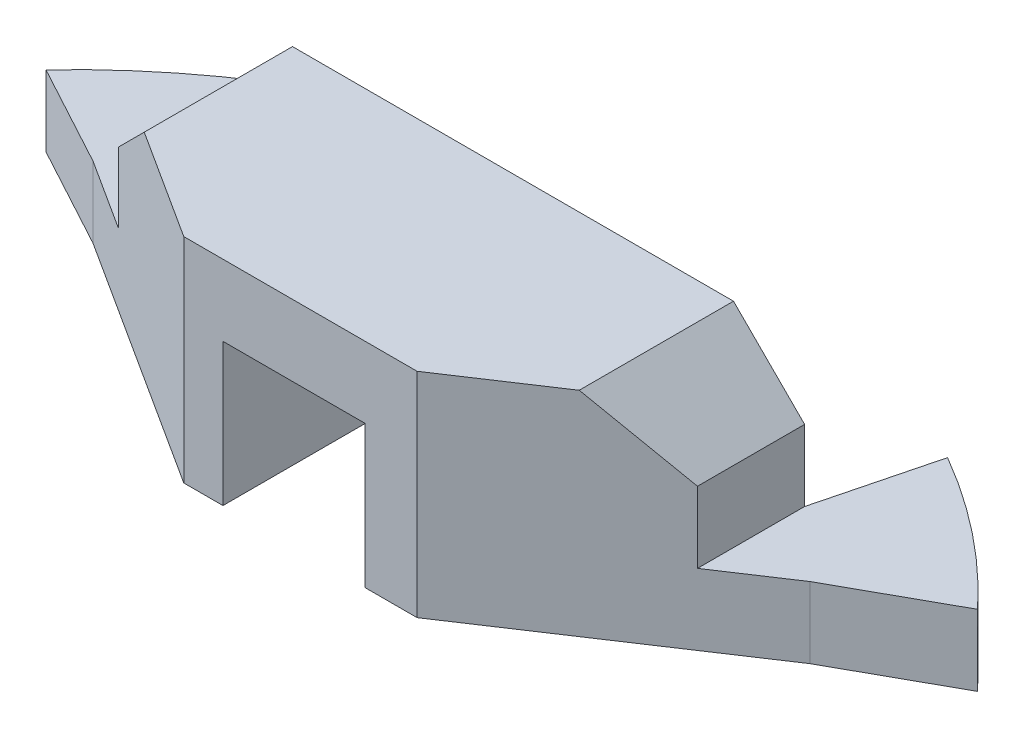
ISO-10303-21;
HEADER;
FILE_DESCRIPTION(('STEP AP214'),'2;1');
FILE_NAME('part.step','',(''),(''),'','','');
FILE_SCHEMA(('AUTOMOTIVE_DESIGN { 1 0 10303 214 1 1 1 1 }'));
ENDSEC;
DATA;
#1=APPLICATION_CONTEXT('core data for automotive mechanical design processes');
#2=APPLICATION_PROTOCOL_DEFINITION('international standard','automotive_design',2000,#1);
#3=PRODUCT_CONTEXT('',#1,'mechanical');
#4=PRODUCT('Part','Part','',(#3));
#5=PRODUCT_RELATED_PRODUCT_CATEGORY('part','',(#4));
#6=PRODUCT_DEFINITION_FORMATION('','',#4);
#7=PRODUCT_DEFINITION_CONTEXT('part definition',#1,'design');
#8=PRODUCT_DEFINITION('design','',#6,#7);
#9=PRODUCT_DEFINITION_SHAPE('','',#8);
#10=(LENGTH_UNIT() NAMED_UNIT(*) SI_UNIT(.MILLI.,.METRE.));
#11=(NAMED_UNIT(*) PLANE_ANGLE_UNIT() SI_UNIT($,.RADIAN.));
#12=(NAMED_UNIT(*) SI_UNIT($,.STERADIAN.) SOLID_ANGLE_UNIT());
#13=UNCERTAINTY_MEASURE_WITH_UNIT(LENGTH_MEASURE(1.E-05),#10,'distance_accuracy_value','');
#14=(GEOMETRIC_REPRESENTATION_CONTEXT(3) GLOBAL_UNCERTAINTY_ASSIGNED_CONTEXT((#13)) GLOBAL_UNIT_ASSIGNED_CONTEXT((#10,
#11,#12)) REPRESENTATION_CONTEXT('',''));
#15=CARTESIAN_POINT('',(0.,0.,0.));
#16=DIRECTION('',(0.,0.,1.));
#17=DIRECTION('',(1.,0.,0.));
#18=AXIS2_PLACEMENT_3D('',#15,#16,#17);
#19=CARTESIAN_POINT('',(0.,0.,0.));
#20=DIRECTION('',(0.,1.,0.));
#21=DIRECTION('',(0.,0.,1.));
#22=AXIS2_PLACEMENT_3D('',#19,#20,#21);
#23=PLANE('',#22);
#24=DIRECTION('',(1.,0.,0.));
#25=VECTOR('',#24,1.);
#26=CARTESIAN_POINT('',(0.,0.,-61.8867391177274));
#27=LINE('',#26,#25);
#28=CARTESIAN_POINT('',(-41.,0.,-61.8867391177274));
#29=VERTEX_POINT('',#28);
#30=CARTESIAN_POINT('',(-10.,0.,-61.8867391177274));
#31=VERTEX_POINT('',#30);
#32=EDGE_CURVE('E266',#29,#31,#27,.T.);
#33=ORIENTED_EDGE('',*,*,#32,.T.);
#34=DIRECTION('',(0.,0.,1.));
#35=VECTOR('',#34,1.);
#36=CARTESIAN_POINT('',(-10.,0.,0.));
#37=LINE('',#36,#35);
#38=CARTESIAN_POINT('',(-10.,0.,-31.1120093792649));
#39=VERTEX_POINT('',#38);
#40=EDGE_CURVE('E11',#31,#39,#37,.T.);
#41=ORIENTED_EDGE('',*,*,#40,.T.);
#42=DIRECTION('',(1.,0.,0.));
#43=VECTOR('',#42,1.);
#44=CARTESIAN_POINT('',(0.,0.,-31.1120093792649));
#45=LINE('',#44,#43);
#46=CARTESIAN_POINT('',(-15.51042360808,0.,-31.1120093792649));
#47=VERTEX_POINT('',#46);
#48=EDGE_CURVE('E293',#47,#39,#45,.T.);
#49=ORIENTED_EDGE('',*,*,#48,.F.);
#50=DIRECTION('',(0.841770349735374,0.,0.539835788278608));
#51=VECTOR('',#50,1.);
#52=CARTESIAN_POINT('',(9.61776043099237,0.,-14.9970523211944));
#53=LINE('',#52,#51);
#54=CARTESIAN_POINT('',(-51.0648929316952,0.,-53.9134480141316));
#55=VERTEX_POINT('',#54);
#56=EDGE_CURVE('E289',#55,#47,#53,.T.);
#57=ORIENTED_EDGE('',*,*,#56,.F.);
#58=DIRECTION('',(0.87933531027418,0.,0.476203120637625));
#59=VECTOR('',#58,1.);
#60=CARTESIAN_POINT('',(10.9958810973952,0.,-20.3045005323974));
#61=LINE('',#60,#59);
#62=CARTESIAN_POINT('',(-65.4952623120171,0.,-61.7281995094631));
#63=VERTEX_POINT('',#62);
#64=EDGE_CURVE('E285',#63,#55,#61,.T.);
#65=ORIENTED_EDGE('',*,*,#64,.F.);
#66=CARTESIAN_POINT('',(0.,0.,0.));
#67=DIRECTION('',(0.,1.,0.));
#68=DIRECTION('',(0.,0.,1.));
#69=AXIS2_PLACEMENT_3D('',#66,#67,#68);
#70=CIRCLE('',#69,90.);
#71=CARTESIAN_POINT('',(-45.0960737715278,0.,-77.8867391177274));
#72=VERTEX_POINT('',#71);
#73=EDGE_CURVE('E281',#72,#63,#70,.T.);
#74=ORIENTED_EDGE('',*,*,#73,.F.);
#75=DIRECTION('',(0.248006602233097,0.,0.968758342027977));
#76=VECTOR('',#75,1.);
#77=CARTESIAN_POINT('',(-23.609388803834,0.,6.04411239007417));
#78=LINE('',#77,#76);
#79=EDGE_CURVE('E261',#72,#29,#78,.T.);
#80=ORIENTED_EDGE('',*,*,#79,.T.);
#81=EDGE_LOOP('',(#33,#41,#49,#57,#65,#74,#80));
#82=FACE_BOUND('',#81,.T.);
#83=ADVANCED_FACE('F47',(#82),#23,.F.);
#84=CARTESIAN_POINT('',(-23.609388803834,30.,6.04411239007417));
#85=DIRECTION('',(0.968758342027977,0.,-0.248006602233097));
#86=DIRECTION('',(-0.248006602233097,0.,-0.968758342027977));
#87=AXIS2_PLACEMENT_3D('',#84,#85,#86);
#88=PLANE('',#87);
#89=DIRECTION('',(0.,-1.,0.));
#90=VECTOR('',#89,1.);
#91=CARTESIAN_POINT('',(-45.0960737715278,30.,-77.8867391177274));
#92=LINE('',#91,#90);
#93=CARTESIAN_POINT('',(-45.0960737715278,10.,-77.8867391177274));
#94=VERTEX_POINT('',#93);
#95=EDGE_CURVE('E346',#94,#72,#92,.T.);
#96=ORIENTED_EDGE('',*,*,#95,.F.);
#97=DIRECTION('',(0.248006602233097,0.,0.968758342027977));
#98=VECTOR('',#97,1.);
#99=CARTESIAN_POINT('',(-23.609388803834,10.,6.04411239007417));
#100=LINE('',#99,#98);
#101=CARTESIAN_POINT('',(-41.,10.,-61.8867391177274));
#102=VERTEX_POINT('',#101);
#103=EDGE_CURVE('E236',#94,#102,#100,.T.);
#104=ORIENTED_EDGE('',*,*,#103,.T.);
#105=DIRECTION('',(0.,-1.,0.));
#106=VECTOR('',#105,1.);
#107=CARTESIAN_POINT('',(-41.,30.,-61.8867391177274));
#108=LINE('',#107,#106);
#109=EDGE_CURVE('E277',#102,#29,#108,.T.);
#110=ORIENTED_EDGE('',*,*,#109,.T.);
#111=ORIENTED_EDGE('',*,*,#79,.F.);
#112=EDGE_LOOP('',(#96,#104,#110,#111));
#113=FACE_BOUND('',#112,.T.);
#114=ADVANCED_FACE('F416',(#113),#88,.T.);
#115=CARTESIAN_POINT('',(0.,30.,0.));
#116=DIRECTION('',(0.,-1.,0.));
#117=DIRECTION('',(0.,0.,-1.));
#118=AXIS2_PLACEMENT_3D('',#115,#116,#117);
#119=CYLINDRICAL_SURFACE('',#118,90.);
#120=CARTESIAN_POINT('',(0.,10.,0.));
#121=DIRECTION('',(0.,1.,0.));
#122=DIRECTION('',(0.,0.,1.));
#123=AXIS2_PLACEMENT_3D('',#120,#121,#122);
#124=CIRCLE('',#123,90.);
#125=CARTESIAN_POINT('',(-65.4952623120171,10.,-61.7281995094631));
#126=VERTEX_POINT('',#125);
#127=EDGE_CURVE('E233',#94,#126,#124,.T.);
#128=ORIENTED_EDGE('',*,*,#127,.F.);
#129=ORIENTED_EDGE('',*,*,#95,.T.);
#130=ORIENTED_EDGE('',*,*,#73,.T.);
#131=DIRECTION('',(0.,-1.,0.));
#132=VECTOR('',#131,1.);
#133=CARTESIAN_POINT('',(-65.4952623120171,30.,-61.7281995094631));
#134=LINE('',#133,#132);
#135=EDGE_CURVE('E343',#126,#63,#134,.T.);
#136=ORIENTED_EDGE('',*,*,#135,.F.);
#137=EDGE_LOOP('',(#128,#129,#130,#136));
#138=FACE_BOUND('',#137,.T.);
#139=ADVANCED_FACE('F425',(#138),#119,.T.);
#140=CARTESIAN_POINT('',(10.9958810973952,30.,-20.3045005323974));
#141=DIRECTION('',(0.476203120637625,0.,-0.87933531027418));
#142=DIRECTION('',(-0.87933531027418,0.,-0.476203120637625));
#143=AXIS2_PLACEMENT_3D('',#140,#141,#142);
#144=PLANE('',#143);
#145=DIRECTION('',(0.87933531027418,0.,0.476203120637625));
#146=VECTOR('',#145,1.);
#147=CARTESIAN_POINT('',(10.9958810973952,10.,-20.3045005323974));
#148=LINE('',#147,#146);
#149=CARTESIAN_POINT('',(-51.0648929316952,10.,-53.9134480141316));
#150=VERTEX_POINT('',#149);
#151=EDGE_CURVE('E230',#126,#150,#148,.T.);
#152=ORIENTED_EDGE('',*,*,#151,.F.);
#153=ORIENTED_EDGE('',*,*,#135,.T.);
#154=ORIENTED_EDGE('',*,*,#64,.T.);
#155=DIRECTION('',(0.,-1.,0.));
#156=VECTOR('',#155,1.);
#157=CARTESIAN_POINT('',(-51.0648929316952,30.,-53.9134480141316));
#158=LINE('',#157,#156);
#159=EDGE_CURVE('E340',#150,#55,#158,.T.);
#160=ORIENTED_EDGE('',*,*,#159,.F.);
#161=EDGE_LOOP('',(#152,#153,#154,#160));
#162=FACE_BOUND('',#161,.T.);
#163=ADVANCED_FACE('F433',(#162),#144,.F.);
#164=CARTESIAN_POINT('',(9.61776043099237,30.,-14.9970523211944));
#165=DIRECTION('',(0.539835788278608,0.,-0.841770349735374));
#166=DIRECTION('',(-0.841770349735374,0.,-0.539835788278608));
#167=AXIS2_PLACEMENT_3D('',#164,#165,#166);
#168=PLANE('',#167);
#169=DIRECTION('',(0.841770349735374,0.,0.539835788278608));
#170=VECTOR('',#169,1.);
#171=CARTESIAN_POINT('',(9.61776043099237,30.,-14.9970523211944));
#172=LINE('',#171,#170);
#173=CARTESIAN_POINT('',(-31.,30.,-41.0456304485536));
#174=VERTEX_POINT('',#173);
#175=CARTESIAN_POINT('',(-15.51042360808,30.,-31.1120093792649));
#176=VERTEX_POINT('',#175);
#177=EDGE_CURVE('E262',#174,#176,#172,.T.);
#178=ORIENTED_EDGE('',*,*,#177,.F.);
#179=DIRECTION('',(0.64398582111014,0.643985821110142,0.412994581584547));
#180=VECTOR('',#179,1.);
#181=CARTESIAN_POINT('',(-20.0833951605996,40.9166048394004,-34.0447020116511));
#182=LINE('',#181,#180);
#183=CARTESIAN_POINT('',(-41.,20.,-47.4587309865842));
#184=VERTEX_POINT('',#183);
#185=EDGE_CURVE('E72',#174,#184,#182,.F.);
#186=ORIENTED_EDGE('',*,*,#185,.T.);
#187=DIRECTION('',(0.,1.,0.));
#188=VECTOR('',#187,1.);
#189=CARTESIAN_POINT('',(-41.,30.,-47.4587309865842));
#190=LINE('',#189,#188);
#191=CARTESIAN_POINT('',(-41.,10.,-47.4587309865842));
#192=VERTEX_POINT('',#191);
#193=EDGE_CURVE('E224',#192,#184,#190,.T.);
#194=ORIENTED_EDGE('',*,*,#193,.F.);
#195=DIRECTION('',(0.841770349735374,0.,0.539835788278608));
#196=VECTOR('',#195,1.);
#197=CARTESIAN_POINT('',(9.61776043099237,10.,-14.9970523211944));
#198=LINE('',#197,#196);
#199=EDGE_CURVE('E227',#150,#192,#198,.T.);
#200=ORIENTED_EDGE('',*,*,#199,.F.);
#201=ORIENTED_EDGE('',*,*,#159,.T.);
#202=ORIENTED_EDGE('',*,*,#56,.T.);
#203=DIRECTION('',(0.,-1.,0.));
#204=VECTOR('',#203,1.);
#205=CARTESIAN_POINT('',(-15.51042360808,30.,-31.1120093792649));
#206=LINE('',#205,#204);
#207=EDGE_CURVE('E336',#176,#47,#206,.T.);
#208=ORIENTED_EDGE('',*,*,#207,.F.);
#209=EDGE_LOOP('',(#178,#186,#194,#200,#201,#202,#208));
#210=FACE_BOUND('',#209,.T.);
#211=ADVANCED_FACE('F434',(#210),#168,.F.);
#212=CARTESIAN_POINT('',(0.,30.,0.));
#213=DIRECTION('',(0.,1.,0.));
#214=DIRECTION('',(0.,0.,1.));
#215=AXIS2_PLACEMENT_3D('',#212,#213,#214);
#216=PLANE('',#215);
#217=DIRECTION('',(0.833563395359858,0.,-0.552423810055419));
#218=VECTOR('',#217,1.);
#219=CARTESIAN_POINT('',(-9.0504860279359,30.,-13.6564603584816));
#220=LINE('',#219,#218);
#221=CARTESIAN_POINT('',(17.288542892948,30.,-31.1120093792649));
#222=VERTEX_POINT('',#221);
#223=CARTESIAN_POINT('',(31.,30.,-40.198943160971));
#224=VERTEX_POINT('',#223);
#225=EDGE_CURVE('E269',#222,#224,#220,.T.);
#226=ORIENTED_EDGE('',*,*,#225,.T.);
#227=DIRECTION('',(0.,0.,-1.));
#228=VECTOR('',#227,1.);
#229=CARTESIAN_POINT('',(31.,30.,-61.8867391177274));
#230=LINE('',#229,#228);
#231=CARTESIAN_POINT('',(31.,30.,-61.8867391177274));
#232=VERTEX_POINT('',#231);
#233=EDGE_CURVE('E360',#224,#232,#230,.T.);
#234=ORIENTED_EDGE('',*,*,#233,.T.);
#235=DIRECTION('',(1.,0.,0.));
#236=VECTOR('',#235,1.);
#237=CARTESIAN_POINT('',(0.,30.,-61.8867391177274));
#238=LINE('',#237,#236);
#239=CARTESIAN_POINT('',(-31.,30.,-61.8867391177274));
#240=VERTEX_POINT('',#239);
#241=EDGE_CURVE('E273',#240,#232,#238,.T.);
#242=ORIENTED_EDGE('',*,*,#241,.F.);
#243=DIRECTION('',(0.,0.,1.));
#244=VECTOR('',#243,1.);
#245=CARTESIAN_POINT('',(-31.,30.,0.));
#246=LINE('',#245,#244);
#247=EDGE_CURVE('E356',#240,#174,#246,.T.);
#248=ORIENTED_EDGE('',*,*,#247,.T.);
#249=ORIENTED_EDGE('',*,*,#177,.T.);
#250=DIRECTION('',(1.,0.,0.));
#251=VECTOR('',#250,1.);
#252=CARTESIAN_POINT('',(0.,30.,-31.1120093792649));
#253=LINE('',#252,#251);
#254=EDGE_CURVE('E265',#176,#222,#253,.T.);
#255=ORIENTED_EDGE('',*,*,#254,.T.);
#256=EDGE_LOOP('',(#226,#234,#242,#248,#249,#255));
#257=FACE_BOUND('',#256,.T.);
#258=ADVANCED_FACE('F444',(#257),#216,.T.);
#259=CARTESIAN_POINT('',(-10.6559991651872,30.,-19.2239770407541));
#260=DIRECTION('',(-0.48480873926689,0.,-0.874620195473698));
#261=DIRECTION('',(-0.874620195473698,0.,0.48480873926689));
#262=AXIS2_PLACEMENT_3D('',#259,#260,#261);
#263=PLANE('',#262);
#264=DIRECTION('',(0.874620195473698,0.,-0.48480873926689));
#265=VECTOR('',#264,1.);
#266=CARTESIAN_POINT('',(-10.6559991651872,10.,-19.2239770407541));
#267=LINE('',#266,#265);
#268=CARTESIAN_POINT('',(50.5104026715854,10.,-53.1289866820155));
#269=VERTEX_POINT('',#268);
#270=CARTESIAN_POINT('',(65.6762918132263,10.,-61.5355563366737));
#271=VERTEX_POINT('',#270);
#272=EDGE_CURVE('E255',#269,#271,#267,.T.);
#273=ORIENTED_EDGE('',*,*,#272,.F.);
#274=DIRECTION('',(0.,-1.,0.));
#275=VECTOR('',#274,1.);
#276=CARTESIAN_POINT('',(50.5104026715854,30.,-53.1289866820155));
#277=LINE('',#276,#275);
#278=CARTESIAN_POINT('',(50.5104026715854,0.,-53.1289866820155));
#279=VERTEX_POINT('',#278);
#280=EDGE_CURVE('E329',#269,#279,#277,.T.);
#281=ORIENTED_EDGE('',*,*,#280,.T.);
#282=DIRECTION('',(0.874620195473698,0.,-0.48480873926689));
#283=VECTOR('',#282,1.);
#284=CARTESIAN_POINT('',(-10.6559991651872,0.,-19.2239770407541));
#285=LINE('',#284,#283);
#286=CARTESIAN_POINT('',(65.6762918132264,0.,-61.5355563366737));
#287=VERTEX_POINT('',#286);
#288=EDGE_CURVE('E301',#279,#287,#285,.T.);
#289=ORIENTED_EDGE('',*,*,#288,.T.);
#290=DIRECTION('',(0.,-1.,0.));
#291=VECTOR('',#290,1.);
#292=CARTESIAN_POINT('',(65.6762918132264,30.,-61.5355563366737));
#293=LINE('',#292,#291);
#294=EDGE_CURVE('E326',#271,#287,#293,.T.);
#295=ORIENTED_EDGE('',*,*,#294,.F.);
#296=EDGE_LOOP('',(#273,#281,#289,#295));
#297=FACE_BOUND('',#296,.T.);
#298=ADVANCED_FACE('F396',(#297),#263,.F.);
#299=CARTESIAN_POINT('',(0.,30.,0.));
#300=DIRECTION('',(0.,-1.,0.));
#301=DIRECTION('',(0.,0.,-1.));
#302=AXIS2_PLACEMENT_3D('',#299,#300,#301);
#303=CYLINDRICAL_SURFACE('',#302,90.);
#304=CARTESIAN_POINT('',(0.,10.,0.));
#305=DIRECTION('',(0.,1.,0.));
#306=DIRECTION('',(0.,0.,1.));
#307=AXIS2_PLACEMENT_3D('',#304,#305,#306);
#308=CIRCLE('',#307,90.);
#309=CARTESIAN_POINT('',(45.0960737715278,10.,-77.8867391177274));
#310=VERTEX_POINT('',#309);
#311=EDGE_CURVE('E252',#271,#310,#308,.T.);
#312=ORIENTED_EDGE('',*,*,#311,.F.);
#313=ORIENTED_EDGE('',*,*,#294,.T.);
#314=CARTESIAN_POINT('',(0.,0.,0.));
#315=DIRECTION('',(0.,1.,0.));
#316=DIRECTION('',(0.,0.,1.));
#317=AXIS2_PLACEMENT_3D('',#314,#315,#316);
#318=CIRCLE('',#317,90.);
#319=CARTESIAN_POINT('',(45.0960737715278,0.,-77.8867391177274));
#320=VERTEX_POINT('',#319);
#321=EDGE_CURVE('E305',#287,#320,#318,.T.);
#322=ORIENTED_EDGE('',*,*,#321,.T.);
#323=DIRECTION('',(0.,-1.,0.));
#324=VECTOR('',#323,1.);
#325=CARTESIAN_POINT('',(45.0960737715278,30.,-77.8867391177274));
#326=LINE('',#325,#324);
#327=EDGE_CURVE('E323',#310,#320,#326,.T.);
#328=ORIENTED_EDGE('',*,*,#327,.F.);
#329=EDGE_LOOP('',(#312,#313,#322,#328));
#330=FACE_BOUND('',#329,.T.);
#331=ADVANCED_FACE('F478',(#330),#303,.T.);
#332=CARTESIAN_POINT('',(23.6093888038338,30.,6.04411239007418));
#333=DIRECTION('',(0.968758342027976,0.,0.2480066022331));
#334=DIRECTION('',(0.2480066022331,0.,-0.968758342027976));
#335=AXIS2_PLACEMENT_3D('',#332,#333,#334);
#336=PLANE('',#335);
#337=DIRECTION('',(-0.2480066022331,0.,0.968758342027976));
#338=VECTOR('',#337,1.);
#339=CARTESIAN_POINT('',(23.6093888038338,10.,6.04411239007418));
#340=LINE('',#339,#338);
#341=CARTESIAN_POINT('',(41.,10.,-61.8867391177274));
#342=VERTEX_POINT('',#341);
#343=EDGE_CURVE('E248',#310,#342,#340,.T.);
#344=ORIENTED_EDGE('',*,*,#343,.F.);
#345=ORIENTED_EDGE('',*,*,#327,.T.);
#346=DIRECTION('',(-0.2480066022331,0.,0.968758342027976));
#347=VECTOR('',#346,1.);
#348=CARTESIAN_POINT('',(23.6093888038338,0.,6.04411239007418));
#349=LINE('',#348,#347);
#350=CARTESIAN_POINT('',(41.,0.,-61.8867391177274));
#351=VERTEX_POINT('',#350);
#352=EDGE_CURVE('E309',#320,#351,#349,.T.);
#353=ORIENTED_EDGE('',*,*,#352,.T.);
#354=DIRECTION('',(0.,-1.,0.));
#355=VECTOR('',#354,1.);
#356=CARTESIAN_POINT('',(41.,30.,-61.8867391177274));
#357=LINE('',#356,#355);
#358=EDGE_CURVE('E319',#342,#351,#357,.T.);
#359=ORIENTED_EDGE('',*,*,#358,.F.);
#360=EDGE_LOOP('',(#344,#345,#353,#359));
#361=FACE_BOUND('',#360,.T.);
#362=ADVANCED_FACE('F408',(#361),#336,.F.);
#363=CARTESIAN_POINT('',(0.,30.,-31.1120093792649));
#364=DIRECTION('',(0.,0.,-1.));
#365=DIRECTION('',(-1.,0.,0.));
#366=AXIS2_PLACEMENT_3D('',#363,#364,#365);
#367=PLANE('',#366);
#368=ORIENTED_EDGE('',*,*,#48,.T.);
#369=DIRECTION('',(0.,1.,0.));
#370=VECTOR('',#369,1.);
#371=CARTESIAN_POINT('',(-10.,30.,-31.1120093792649));
#372=LINE('',#371,#370);
#373=CARTESIAN_POINT('',(-10.,20.,-31.1120093792649));
#374=VERTEX_POINT('',#373);
#375=EDGE_CURVE('E215',#39,#374,#372,.T.);
#376=ORIENTED_EDGE('',*,*,#375,.T.);
#377=DIRECTION('',(1.,0.,0.));
#378=VECTOR('',#377,1.);
#379=CARTESIAN_POINT('',(0.,20.,-31.1120093792649));
#380=LINE('',#379,#378);
#381=CARTESIAN_POINT('',(10.,20.,-31.1120093792649));
#382=VERTEX_POINT('',#381);
#383=EDGE_CURVE('E188',#374,#382,#380,.T.);
#384=ORIENTED_EDGE('',*,*,#383,.T.);
#385=DIRECTION('',(0.,-1.,0.));
#386=VECTOR('',#385,1.);
#387=CARTESIAN_POINT('',(9.99999999999999,30.,-31.1120093792649));
#388=LINE('',#387,#386);
#389=CARTESIAN_POINT('',(10.,0.,-31.1120093792649));
#390=VERTEX_POINT('',#389);
#391=EDGE_CURVE('E210',#382,#390,#388,.T.);
#392=ORIENTED_EDGE('',*,*,#391,.T.);
#393=CARTESIAN_POINT('',(17.288542892948,0.,-31.1120093792649));
#394=VERTEX_POINT('',#393);
#395=EDGE_CURVE('E292',#390,#394,#45,.T.);
#396=ORIENTED_EDGE('',*,*,#395,.T.);
#397=DIRECTION('',(0.,-1.,0.));
#398=VECTOR('',#397,1.);
#399=CARTESIAN_POINT('',(17.288542892948,30.,-31.1120093792649));
#400=LINE('',#399,#398);
#401=EDGE_CURVE('E332',#222,#394,#400,.T.);
#402=ORIENTED_EDGE('',*,*,#401,.F.);
#403=ORIENTED_EDGE('',*,*,#254,.F.);
#404=ORIENTED_EDGE('',*,*,#207,.T.);
#405=EDGE_LOOP('',(#368,#376,#384,#392,#396,#402,#403,#404));
#406=FACE_BOUND('',#405,.T.);
#407=ADVANCED_FACE('F385',(#406),#367,.F.);
#408=CARTESIAN_POINT('',(-9.0504860279359,30.,-13.6564603584816));
#409=DIRECTION('',(-0.552423810055418,0.,-0.833563395359858));
#410=DIRECTION('',(-0.833563395359858,0.,0.552423810055419));
#411=AXIS2_PLACEMENT_3D('',#408,#409,#410);
#412=PLANE('',#411);
#413=DIRECTION('',(0.,1.,0.));
#414=VECTOR('',#413,1.);
#415=CARTESIAN_POINT('',(41.,30.,-46.8261992656723));
#416=LINE('',#415,#414);
#417=CARTESIAN_POINT('',(41.,10.,-46.8261992656723));
#418=VERTEX_POINT('',#417);
#419=CARTESIAN_POINT('',(41.,20.,-46.8261992656723));
#420=VERTEX_POINT('',#419);
#421=EDGE_CURVE('E244',#418,#420,#416,.T.);
#422=ORIENTED_EDGE('',*,*,#421,.T.);
#423=DIRECTION('',(-0.640288686678544,0.640288686678542,0.424335710756157));
#424=VECTOR('',#423,1.);
#425=CARTESIAN_POINT('',(45.0919088419355,15.9080911580645,-49.5380120509321));
#426=LINE('',#425,#424);
#427=EDGE_CURVE('E353',#420,#224,#426,.T.);
#428=ORIENTED_EDGE('',*,*,#427,.T.);
#429=ORIENTED_EDGE('',*,*,#225,.F.);
#430=ORIENTED_EDGE('',*,*,#401,.T.);
#431=DIRECTION('',(0.833563395359858,0.,-0.552423810055419));
#432=VECTOR('',#431,1.);
#433=CARTESIAN_POINT('',(-9.0504860279359,0.,-13.6564603584816));
#434=LINE('',#433,#432);
#435=EDGE_CURVE('E297',#394,#279,#434,.T.);
#436=ORIENTED_EDGE('',*,*,#435,.T.);
#437=ORIENTED_EDGE('',*,*,#280,.F.);
#438=DIRECTION('',(0.833563395359858,0.,-0.552423810055419));
#439=VECTOR('',#438,1.);
#440=CARTESIAN_POINT('',(-9.0504860279359,10.,-13.6564603584816));
#441=LINE('',#440,#439);
#442=EDGE_CURVE('E258',#418,#269,#441,.T.);
#443=ORIENTED_EDGE('',*,*,#442,.F.);
#444=EDGE_LOOP('',(#422,#428,#429,#430,#436,#437,#443));
#445=FACE_BOUND('',#444,.T.);
#446=ADVANCED_FACE('F389',(#445),#412,.F.);
#447=CARTESIAN_POINT('',(0.,30.,-61.8867391177274));
#448=DIRECTION('',(0.,0.,-1.));
#449=DIRECTION('',(-1.,0.,0.));
#450=AXIS2_PLACEMENT_3D('',#447,#448,#449);
#451=PLANE('',#450);
#452=DIRECTION('',(0.,1.,0.));
#453=VECTOR('',#452,1.);
#454=CARTESIAN_POINT('',(-10.,20.,-61.8867391177274));
#455=LINE('',#454,#453);
#456=CARTESIAN_POINT('',(-10.,20.,-61.8867391177274));
#457=VERTEX_POINT('',#456);
#458=EDGE_CURVE('E195',#31,#457,#455,.T.);
#459=ORIENTED_EDGE('',*,*,#458,.F.);
#460=ORIENTED_EDGE('',*,*,#32,.F.);
#461=ORIENTED_EDGE('',*,*,#109,.F.);
#462=CARTESIAN_POINT('',(-41.,20.,-61.8867391177274));
#463=VERTEX_POINT('',#462);
#464=EDGE_CURVE('E316',#463,#102,#108,.T.);
#465=ORIENTED_EDGE('',*,*,#464,.F.);
#466=DIRECTION('',(-0.707106781186547,-0.707106781186549,0.));
#467=VECTOR('',#466,1.);
#468=CARTESIAN_POINT('',(-15.5,45.5,-61.8867391177274));
#469=LINE('',#468,#467);
#470=EDGE_CURVE('E363',#463,#240,#469,.F.);
#471=ORIENTED_EDGE('',*,*,#470,.T.);
#472=ORIENTED_EDGE('',*,*,#241,.T.);
#473=DIRECTION('',(0.707106781186549,-0.707106781186547,0.));
#474=VECTOR('',#473,1.);
#475=CARTESIAN_POINT('',(15.4999999999999,45.5,-61.8867391177274));
#476=LINE('',#475,#474);
#477=CARTESIAN_POINT('',(41.,20.,-61.8867391177274));
#478=VERTEX_POINT('',#477);
#479=EDGE_CURVE('E366',#232,#478,#476,.T.);
#480=ORIENTED_EDGE('',*,*,#479,.T.);
#481=EDGE_CURVE('E320',#478,#342,#357,.T.);
#482=ORIENTED_EDGE('',*,*,#481,.T.);
#483=ORIENTED_EDGE('',*,*,#358,.T.);
#484=CARTESIAN_POINT('',(10.,0.,-61.8867391177274));
#485=VERTEX_POINT('',#484);
#486=EDGE_CURVE('E313',#485,#351,#27,.T.);
#487=ORIENTED_EDGE('',*,*,#486,.F.);
#488=DIRECTION('',(0.,-1.,0.));
#489=VECTOR('',#488,1.);
#490=CARTESIAN_POINT('',(9.99999999999999,20.,-61.8867391177274));
#491=LINE('',#490,#489);
#492=CARTESIAN_POINT('',(9.99999999999999,20.,-61.8867391177274));
#493=VERTEX_POINT('',#492);
#494=EDGE_CURVE('E64',#493,#485,#491,.T.);
#495=ORIENTED_EDGE('',*,*,#494,.F.);
#496=DIRECTION('',(1.,0.,0.));
#497=VECTOR('',#496,1.);
#498=CARTESIAN_POINT('',(9.99999999999999,20.,-61.8867391177274));
#499=LINE('',#498,#497);
#500=EDGE_CURVE('E186',#457,#493,#499,.T.);
#501=ORIENTED_EDGE('',*,*,#500,.F.);
#502=EDGE_LOOP('',(#459,#460,#461,#465,#471,#472,#480,#482,#483,#487,#495,#501));
#503=FACE_BOUND('',#502,.T.);
#504=ADVANCED_FACE('F202',(#503),#451,.T.);
#505=ORIENTED_EDGE('',*,*,#395,.F.);
#506=DIRECTION('',(0.,0.,-1.));
#507=VECTOR('',#506,1.);
#508=CARTESIAN_POINT('',(10.,0.,0.));
#509=LINE('',#508,#507);
#510=EDGE_CURVE('E57',#390,#485,#509,.T.);
#511=ORIENTED_EDGE('',*,*,#510,.T.);
#512=ORIENTED_EDGE('',*,*,#486,.T.);
#513=ORIENTED_EDGE('',*,*,#352,.F.);
#514=ORIENTED_EDGE('',*,*,#321,.F.);
#515=ORIENTED_EDGE('',*,*,#288,.F.);
#516=ORIENTED_EDGE('',*,*,#435,.F.);
#517=EDGE_LOOP('',(#505,#511,#512,#513,#514,#515,#516));
#518=FACE_BOUND('',#517,.T.);
#519=ADVANCED_FACE('F376',(#518),#23,.F.);
#520=CARTESIAN_POINT('',(0.,10.,0.));
#521=DIRECTION('',(0.,1.,0.));
#522=DIRECTION('',(0.,0.,1.));
#523=AXIS2_PLACEMENT_3D('',#520,#521,#522);
#524=PLANE('',#523);
#525=ORIENTED_EDGE('',*,*,#442,.T.);
#526=ORIENTED_EDGE('',*,*,#272,.T.);
#527=ORIENTED_EDGE('',*,*,#311,.T.);
#528=ORIENTED_EDGE('',*,*,#343,.T.);
#529=DIRECTION('',(0.,0.,1.));
#530=VECTOR('',#529,1.);
#531=CARTESIAN_POINT('',(41.,10.,-61.8867391177274));
#532=LINE('',#531,#530);
#533=EDGE_CURVE('E240',#342,#418,#532,.T.);
#534=ORIENTED_EDGE('',*,*,#533,.T.);
#535=EDGE_LOOP('',(#525,#526,#527,#528,#534));
#536=FACE_BOUND('',#535,.T.);
#537=ADVANCED_FACE('F399',(#536),#524,.T.);
#538=CARTESIAN_POINT('',(41.,10.,-61.8867391177274));
#539=DIRECTION('',(-1.,0.,0.));
#540=DIRECTION('',(0.,0.,1.));
#541=AXIS2_PLACEMENT_3D('',#538,#539,#540);
#542=PLANE('',#541);
#543=ORIENTED_EDGE('',*,*,#481,.F.);
#544=DIRECTION('',(0.,0.,1.));
#545=VECTOR('',#544,1.);
#546=CARTESIAN_POINT('',(41.,20.,-46.8261992656723));
#547=LINE('',#546,#545);
#548=EDGE_CURVE('E349',#478,#420,#547,.T.);
#549=ORIENTED_EDGE('',*,*,#548,.T.);
#550=ORIENTED_EDGE('',*,*,#421,.F.);
#551=ORIENTED_EDGE('',*,*,#533,.F.);
#552=EDGE_LOOP('',(#543,#549,#550,#551));
#553=FACE_BOUND('',#552,.T.);
#554=ADVANCED_FACE('F405',(#553),#542,.F.);
#555=CARTESIAN_POINT('',(-41.,10.,-61.8867391177274));
#556=DIRECTION('',(-1.,0.,0.));
#557=DIRECTION('',(0.,0.,1.));
#558=AXIS2_PLACEMENT_3D('',#555,#556,#557);
#559=PLANE('',#558);
#560=ORIENTED_EDGE('',*,*,#193,.T.);
#561=DIRECTION('',(0.,0.,-1.));
#562=VECTOR('',#561,1.);
#563=CARTESIAN_POINT('',(-41.,20.,-61.8867391177274));
#564=LINE('',#563,#562);
#565=EDGE_CURVE('E371',#184,#463,#564,.T.);
#566=ORIENTED_EDGE('',*,*,#565,.T.);
#567=ORIENTED_EDGE('',*,*,#464,.T.);
#568=DIRECTION('',(0.,0.,1.));
#569=VECTOR('',#568,1.);
#570=CARTESIAN_POINT('',(-41.,10.,-61.8867391177274));
#571=LINE('',#570,#569);
#572=EDGE_CURVE('E220',#102,#192,#571,.T.);
#573=ORIENTED_EDGE('',*,*,#572,.T.);
#574=EDGE_LOOP('',(#560,#566,#567,#573));
#575=FACE_BOUND('',#574,.T.);
#576=ADVANCED_FACE('F437',(#575),#559,.T.);
#577=CARTESIAN_POINT('',(0.,10.,0.));
#578=DIRECTION('',(0.,1.,0.));
#579=DIRECTION('',(0.,0.,1.));
#580=AXIS2_PLACEMENT_3D('',#577,#578,#579);
#581=PLANE('',#580);
#582=ORIENTED_EDGE('',*,*,#127,.T.);
#583=ORIENTED_EDGE('',*,*,#151,.T.);
#584=ORIENTED_EDGE('',*,*,#199,.T.);
#585=ORIENTED_EDGE('',*,*,#572,.F.);
#586=ORIENTED_EDGE('',*,*,#103,.F.);
#587=EDGE_LOOP('',(#582,#583,#584,#585,#586));
#588=FACE_BOUND('',#587,.T.);
#589=ADVANCED_FACE('F428',(#588),#581,.T.);
#590=CARTESIAN_POINT('',(41.,20.,-61.8867391177274));
#591=DIRECTION('',(0.707106781186547,0.707106781186549,0.));
#592=DIRECTION('',(0.,0.,-1.));
#593=AXIS2_PLACEMENT_3D('',#590,#591,#592);
#594=PLANE('',#593);
#595=ORIENTED_EDGE('',*,*,#479,.F.);
#596=ORIENTED_EDGE('',*,*,#233,.F.);
#597=ORIENTED_EDGE('',*,*,#427,.F.);
#598=ORIENTED_EDGE('',*,*,#548,.F.);
#599=EDGE_LOOP('',(#595,#596,#597,#598));
#600=FACE_BOUND('',#599,.T.);
#601=ADVANCED_FACE('F449',(#600),#594,.T.);
#602=CARTESIAN_POINT('',(-31.,30.,0.));
#603=DIRECTION('',(0.707106781186549,-0.707106781186547,0.));
#604=DIRECTION('',(0.,0.,1.));
#605=AXIS2_PLACEMENT_3D('',#602,#603,#604);
#606=PLANE('',#605);
#607=ORIENTED_EDGE('',*,*,#470,.F.);
#608=ORIENTED_EDGE('',*,*,#565,.F.);
#609=ORIENTED_EDGE('',*,*,#185,.F.);
#610=ORIENTED_EDGE('',*,*,#247,.F.);
#611=EDGE_LOOP('',(#607,#608,#609,#610));
#612=FACE_BOUND('',#611,.T.);
#613=ADVANCED_FACE('F50',(#612),#606,.F.);
#614=CARTESIAN_POINT('',(10.,20.,-20.5284049291452));
#615=DIRECTION('',(0.,1.,0.));
#616=DIRECTION('',(0.,0.,1.));
#617=AXIS2_PLACEMENT_3D('',#614,#615,#616);
#618=PLANE('',#617);
#619=DIRECTION('',(0.,0.,-1.));
#620=VECTOR('',#619,1.);
#621=CARTESIAN_POINT('',(-10.,20.,-20.5284049291452));
#622=LINE('',#621,#620);
#623=EDGE_CURVE('E181',#374,#457,#622,.T.);
#624=ORIENTED_EDGE('',*,*,#623,.T.);
#625=ORIENTED_EDGE('',*,*,#500,.T.);
#626=DIRECTION('',(0.,0.,-1.));
#627=VECTOR('',#626,1.);
#628=CARTESIAN_POINT('',(10.,20.,-20.5284049291452));
#629=LINE('',#628,#627);
#630=EDGE_CURVE('E192',#382,#493,#629,.T.);
#631=ORIENTED_EDGE('',*,*,#630,.F.);
#632=ORIENTED_EDGE('',*,*,#383,.F.);
#633=EDGE_LOOP('',(#624,#625,#631,#632));
#634=FACE_BOUND('',#633,.T.);
#635=ADVANCED_FACE('F183',(#634),#618,.F.);
#636=CARTESIAN_POINT('',(-10.,20.,-20.5284049291452));
#637=DIRECTION('',(-1.,0.,0.));
#638=DIRECTION('',(0.,-1.,0.));
#639=AXIS2_PLACEMENT_3D('',#636,#637,#638);
#640=PLANE('',#639);
#641=ORIENTED_EDGE('',*,*,#40,.F.);
#642=ORIENTED_EDGE('',*,*,#458,.T.);
#643=ORIENTED_EDGE('',*,*,#623,.F.);
#644=ORIENTED_EDGE('',*,*,#375,.F.);
#645=EDGE_LOOP('',(#641,#642,#643,#644));
#646=FACE_BOUND('',#645,.T.);
#647=ADVANCED_FACE('F196',(#646),#640,.F.);
#648=CARTESIAN_POINT('',(10.,20.,-20.5284049291452));
#649=DIRECTION('',(1.,0.,0.));
#650=DIRECTION('',(0.,1.,0.));
#651=AXIS2_PLACEMENT_3D('',#648,#649,#650);
#652=PLANE('',#651);
#653=ORIENTED_EDGE('',*,*,#630,.T.);
#654=ORIENTED_EDGE('',*,*,#494,.T.);
#655=ORIENTED_EDGE('',*,*,#510,.F.);
#656=ORIENTED_EDGE('',*,*,#391,.F.);
#657=EDGE_LOOP('',(#653,#654,#655,#656));
#658=FACE_BOUND('',#657,.T.);
#659=ADVANCED_FACE('F590',(#658),#652,.F.);
#660=CLOSED_SHELL('',(#83,#114,#139,#163,#211,#258,#298,#331,#362,#407,#446,#504,#519,#537,#554,
#576,#589,#601,#613,#635,#647,#659));
#661=MANIFOLD_SOLID_BREP('B2',#660);
#662=ADVANCED_BREP_SHAPE_REPRESENTATION('',(#18,#661),#14);
#663=SHAPE_DEFINITION_REPRESENTATION(#9,#662);
ENDSEC;
END-ISO-10303-21;
